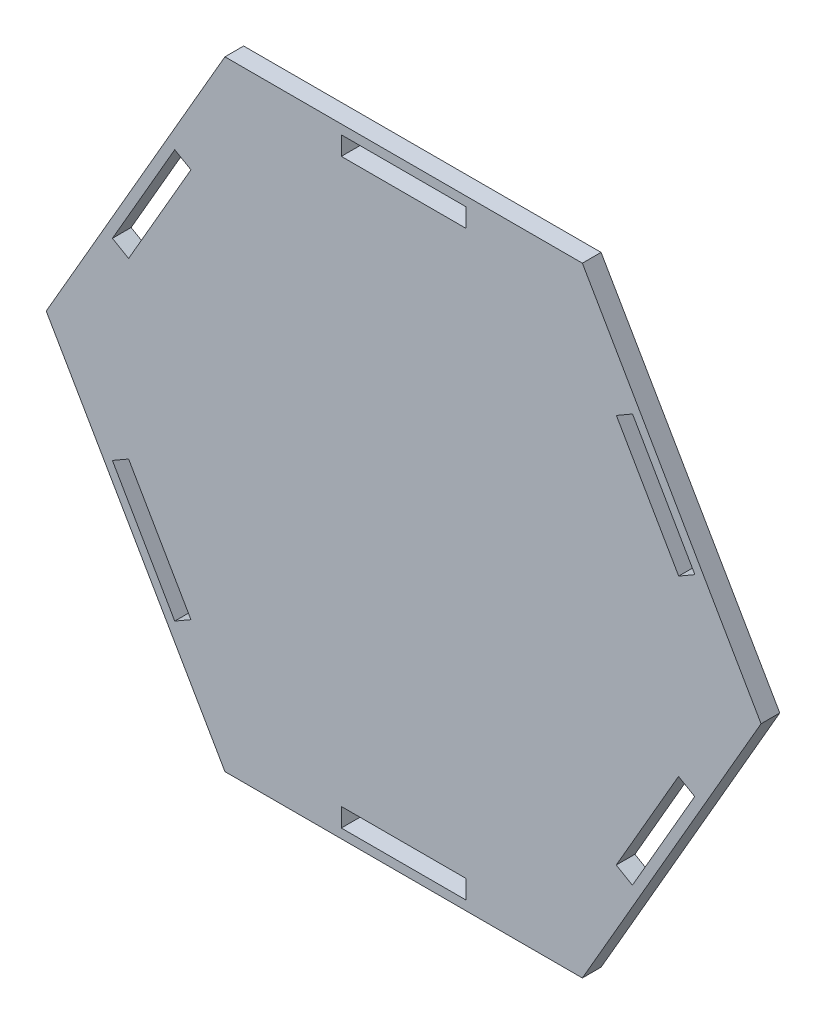
ISO-10303-21;
HEADER;
FILE_DESCRIPTION(('STEP AP214'),'2;1');
FILE_NAME('part.step','',(''),(''),'','','');
FILE_SCHEMA(('AUTOMOTIVE_DESIGN { 1 0 10303 214 1 1 1 1 }'));
ENDSEC;
DATA;
#1=APPLICATION_CONTEXT('core data for automotive mechanical design processes');
#2=APPLICATION_PROTOCOL_DEFINITION('international standard','automotive_design',2000,#1);
#3=PRODUCT_CONTEXT('',#1,'mechanical');
#4=PRODUCT('Part','Part','',(#3));
#5=PRODUCT_RELATED_PRODUCT_CATEGORY('part','',(#4));
#6=PRODUCT_DEFINITION_FORMATION('','',#4);
#7=PRODUCT_DEFINITION_CONTEXT('part definition',#1,'design');
#8=PRODUCT_DEFINITION('design','',#6,#7);
#9=PRODUCT_DEFINITION_SHAPE('','',#8);
#10=(LENGTH_UNIT() NAMED_UNIT(*) SI_UNIT(.MILLI.,.METRE.));
#11=(NAMED_UNIT(*) PLANE_ANGLE_UNIT() SI_UNIT($,.RADIAN.));
#12=(NAMED_UNIT(*) SI_UNIT($,.STERADIAN.) SOLID_ANGLE_UNIT());
#13=UNCERTAINTY_MEASURE_WITH_UNIT(LENGTH_MEASURE(1.E-05),#10,'distance_accuracy_value','');
#14=(GEOMETRIC_REPRESENTATION_CONTEXT(3) GLOBAL_UNCERTAINTY_ASSIGNED_CONTEXT((#13)) GLOBAL_UNIT_ASSIGNED_CONTEXT((#10,
#11,#12)) REPRESENTATION_CONTEXT('',''));
#15=CARTESIAN_POINT('',(0.,0.,0.));
#16=DIRECTION('',(0.,0.,1.));
#17=DIRECTION('',(1.,0.,0.));
#18=AXIS2_PLACEMENT_3D('',#15,#16,#17);
#19=CARTESIAN_POINT('',(0.,0.,3.));
#20=DIRECTION('',(0.,0.,1.));
#21=DIRECTION('',(1.,0.,0.));
#22=AXIS2_PLACEMENT_3D('',#19,#20,#21);
#23=PLANE('',#22);
#24=DIRECTION('',(0.5,0.866025403784439,0.));
#25=VECTOR('',#24,1.);
#26=CARTESIAN_POINT('',(120.785258915504,6.03675021265521,3.));
#27=LINE('',#26,#25);
#28=CARTESIAN_POINT('',(120.785258915504,6.03675021265521,3.));
#29=VERTEX_POINT('',#28);
#30=CARTESIAN_POINT('',(149.457182745941,55.6979790377182,3.));
#31=VERTEX_POINT('',#30);
#32=EDGE_CURVE('E500',#29,#31,#27,.T.);
#33=ORIENTED_EDGE('',*,*,#32,.T.);
#34=DIRECTION('',(-0.499999999999999,0.866025403784439,0.));
#35=VECTOR('',#34,1.);
#36=CARTESIAN_POINT('',(149.457182745941,55.6979790377182,3.));
#37=LINE('',#36,#35);
#38=CARTESIAN_POINT('',(120.785258915504,105.359207862781,3.));
#39=VERTEX_POINT('',#38);
#40=EDGE_CURVE('E504',#31,#39,#37,.T.);
#41=ORIENTED_EDGE('',*,*,#40,.T.);
#42=DIRECTION('',(-1.,0.,0.));
#43=VECTOR('',#42,1.);
#44=CARTESIAN_POINT('',(120.785258915504,105.359207862781,3.));
#45=LINE('',#44,#43);
#46=CARTESIAN_POINT('',(63.4414112546282,105.359207862781,3.));
#47=VERTEX_POINT('',#46);
#48=EDGE_CURVE('E508',#39,#47,#45,.T.);
#49=ORIENTED_EDGE('',*,*,#48,.T.);
#50=DIRECTION('',(-0.5,-0.866025403784438,0.));
#51=VECTOR('',#50,1.);
#52=CARTESIAN_POINT('',(63.4414112546282,105.359207862781,3.));
#53=LINE('',#52,#51);
#54=CARTESIAN_POINT('',(34.7694874241905,55.6979790377182,3.));
#55=VERTEX_POINT('',#54);
#56=EDGE_CURVE('E511',#47,#55,#53,.T.);
#57=ORIENTED_EDGE('',*,*,#56,.T.);
#58=DIRECTION('',(0.5,-0.866025403784439,0.));
#59=VECTOR('',#58,1.);
#60=CARTESIAN_POINT('',(34.7694874241905,55.6979790377182,3.));
#61=LINE('',#60,#59);
#62=CARTESIAN_POINT('',(63.4414112546282,6.03675021265524,3.));
#63=VERTEX_POINT('',#62);
#64=EDGE_CURVE('E514',#55,#63,#61,.T.);
#65=ORIENTED_EDGE('',*,*,#64,.T.);
#66=DIRECTION('',(1.,0.,0.));
#67=VECTOR('',#66,1.);
#68=CARTESIAN_POINT('',(63.4414112546282,6.03675021265524,3.));
#69=LINE('',#68,#67);
#70=EDGE_CURVE('E517',#63,#29,#69,.T.);
#71=ORIENTED_EDGE('',*,*,#70,.T.);
#72=EDGE_LOOP('',(#33,#41,#49,#57,#65,#71));
#73=FACE_BOUND('',#72,.T.);
#74=DIRECTION('',(0.,-1.,0.));
#75=VECTOR('',#74,1.);
#76=CARTESIAN_POINT('',(82.113335085066,103.859207862781,3.));
#77=LINE('',#76,#75);
#78=CARTESIAN_POINT('',(82.113335085066,103.859207862781,3.));
#79=VERTEX_POINT('',#78);
#80=CARTESIAN_POINT('',(82.113335085066,100.859207862781,3.));
#81=VERTEX_POINT('',#80);
#82=EDGE_CURVE('E460',#79,#81,#77,.T.);
#83=ORIENTED_EDGE('',*,*,#82,.F.);
#84=DIRECTION('',(-1.,0.,0.));
#85=VECTOR('',#84,1.);
#86=CARTESIAN_POINT('',(102.113335085066,103.859207862781,3.));
#87=LINE('',#86,#85);
#88=CARTESIAN_POINT('',(102.113335085066,103.859207862781,3.));
#89=VERTEX_POINT('',#88);
#90=EDGE_CURVE('E457',#89,#79,#87,.T.);
#91=ORIENTED_EDGE('',*,*,#90,.F.);
#92=DIRECTION('',(0.,1.,0.));
#93=VECTOR('',#92,1.);
#94=CARTESIAN_POINT('',(102.113335085066,100.859207862781,3.));
#95=LINE('',#94,#93);
#96=CARTESIAN_POINT('',(102.113335085066,100.859207862781,3.));
#97=VERTEX_POINT('',#96);
#98=EDGE_CURVE('E468',#97,#89,#95,.T.);
#99=ORIENTED_EDGE('',*,*,#98,.F.);
#100=DIRECTION('',(1.,0.,0.));
#101=VECTOR('',#100,1.);
#102=CARTESIAN_POINT('',(82.113335085066,100.859207862781,3.));
#103=LINE('',#102,#101);
#104=EDGE_CURVE('E464',#81,#97,#103,.T.);
#105=ORIENTED_EDGE('',*,*,#104,.F.);
#106=EDGE_LOOP('',(#83,#91,#99,#105));
#107=FACE_BOUND('',#106,.T.);
#108=DIRECTION('',(0.,-1.,0.));
#109=VECTOR('',#108,1.);
#110=CARTESIAN_POINT('',(82.113335085066,10.5367502126552,3.));
#111=LINE('',#110,#109);
#112=CARTESIAN_POINT('',(82.113335085066,10.5367502126552,3.));
#113=VERTEX_POINT('',#112);
#114=CARTESIAN_POINT('',(82.113335085066,7.53675021265524,3.));
#115=VERTEX_POINT('',#114);
#116=EDGE_CURVE('E417',#113,#115,#111,.T.);
#117=ORIENTED_EDGE('',*,*,#116,.F.);
#118=DIRECTION('',(-1.,0.,0.));
#119=VECTOR('',#118,1.);
#120=CARTESIAN_POINT('',(102.113335085066,10.5367502126552,3.));
#121=LINE('',#120,#119);
#122=CARTESIAN_POINT('',(102.113335085066,10.5367502126552,3.));
#123=VERTEX_POINT('',#122);
#124=EDGE_CURVE('E414',#123,#113,#121,.T.);
#125=ORIENTED_EDGE('',*,*,#124,.F.);
#126=DIRECTION('',(0.,1.,0.));
#127=VECTOR('',#126,1.);
#128=CARTESIAN_POINT('',(102.113335085066,7.53675021265524,3.));
#129=LINE('',#128,#127);
#130=CARTESIAN_POINT('',(102.113335085066,7.53675021265524,3.));
#131=VERTEX_POINT('',#130);
#132=EDGE_CURVE('E425',#131,#123,#129,.T.);
#133=ORIENTED_EDGE('',*,*,#132,.F.);
#134=DIRECTION('',(1.,0.,0.));
#135=VECTOR('',#134,1.);
#136=CARTESIAN_POINT('',(82.113335085066,7.53675021265524,3.));
#137=LINE('',#136,#135);
#138=EDGE_CURVE('E421',#115,#131,#137,.T.);
#139=ORIENTED_EDGE('',*,*,#138,.F.);
#140=EDGE_LOOP('',(#117,#125,#133,#139));
#141=FACE_BOUND('',#140,.T.);
#142=DIRECTION('',(0.866025403784437,-0.500000000000003,0.));
#143=VECTOR('',#142,1.);
#144=CARTESIAN_POINT('',(126.215627262416,24.442424093322,3.));
#145=LINE('',#144,#143);
#146=CARTESIAN_POINT('',(126.215627262416,24.442424093322,3.));
#147=VERTEX_POINT('',#146);
#148=CARTESIAN_POINT('',(128.81370347377,22.942424093322,3.));
#149=VERTEX_POINT('',#148);
#150=EDGE_CURVE('E374',#147,#149,#145,.T.);
#151=ORIENTED_EDGE('',*,*,#150,.F.);
#152=DIRECTION('',(-0.499999999999998,-0.86602540378444,0.));
#153=VECTOR('',#152,1.);
#154=CARTESIAN_POINT('',(136.215627262416,41.7629321690107,3.));
#155=LINE('',#154,#153);
#156=CARTESIAN_POINT('',(136.215627262416,41.7629321690107,3.));
#157=VERTEX_POINT('',#156);
#158=EDGE_CURVE('E371',#157,#147,#155,.T.);
#159=ORIENTED_EDGE('',*,*,#158,.F.);
#160=DIRECTION('',(-0.866025403784439,0.499999999999998,0.));
#161=VECTOR('',#160,1.);
#162=CARTESIAN_POINT('',(138.81370347377,40.2629321690107,3.));
#163=LINE('',#162,#161);
#164=CARTESIAN_POINT('',(138.81370347377,40.2629321690107,3.));
#165=VERTEX_POINT('',#164);
#166=EDGE_CURVE('E382',#165,#157,#163,.T.);
#167=ORIENTED_EDGE('',*,*,#166,.F.);
#168=DIRECTION('',(0.499999999999999,0.866025403784439,0.));
#169=VECTOR('',#168,1.);
#170=CARTESIAN_POINT('',(128.81370347377,22.942424093322,3.));
#171=LINE('',#170,#169);
#172=EDGE_CURVE('E378',#149,#165,#171,.T.);
#173=ORIENTED_EDGE('',*,*,#172,.F.);
#174=EDGE_LOOP('',(#151,#159,#167,#173));
#175=FACE_BOUND('',#174,.T.);
#176=DIRECTION('',(-0.866025403784437,-0.500000000000003,0.));
#177=VECTOR('',#176,1.);
#178=CARTESIAN_POINT('',(128.839141227598,88.4290564920805,3.));
#179=LINE('',#178,#177);
#180=CARTESIAN_POINT('',(128.839141227598,88.4290564920805,3.));
#181=VERTEX_POINT('',#180);
#182=CARTESIAN_POINT('',(126.241065016245,86.9290564920805,3.));
#183=VERTEX_POINT('',#182);
#184=EDGE_CURVE('E331',#181,#183,#179,.T.);
#185=ORIENTED_EDGE('',*,*,#184,.F.);
#186=DIRECTION('',(-0.499999999999998,0.86602540378444,0.));
#187=VECTOR('',#186,1.);
#188=CARTESIAN_POINT('',(138.839141227598,71.1085484163918,3.));
#189=LINE('',#188,#187);
#190=CARTESIAN_POINT('',(138.839141227598,71.1085484163918,3.));
#191=VERTEX_POINT('',#190);
#192=EDGE_CURVE('E328',#191,#181,#189,.T.);
#193=ORIENTED_EDGE('',*,*,#192,.F.);
#194=DIRECTION('',(0.866025403784439,0.499999999999998,0.));
#195=VECTOR('',#194,1.);
#196=CARTESIAN_POINT('',(136.241065016245,69.6085484163918,3.));
#197=LINE('',#196,#195);
#198=CARTESIAN_POINT('',(136.241065016245,69.6085484163918,3.));
#199=VERTEX_POINT('',#198);
#200=EDGE_CURVE('E339',#199,#191,#197,.T.);
#201=ORIENTED_EDGE('',*,*,#200,.F.);
#202=DIRECTION('',(0.499999999999997,-0.86602540378444,0.));
#203=VECTOR('',#202,1.);
#204=CARTESIAN_POINT('',(126.241065016245,86.9290564920805,3.));
#205=LINE('',#204,#203);
#206=EDGE_CURVE('E335',#183,#199,#205,.T.);
#207=ORIENTED_EDGE('',*,*,#206,.F.);
#208=EDGE_LOOP('',(#185,#193,#201,#207));
#209=FACE_BOUND('',#208,.T.);
#210=DIRECTION('',(0.866025403784439,0.499999999999999,0.));
#211=VECTOR('',#210,1.);
#212=CARTESIAN_POINT('',(55.3875289425339,22.9277375993015,3.));
#213=LINE('',#212,#211);
#214=CARTESIAN_POINT('',(55.3875289425339,22.9277375993015,3.));
#215=VERTEX_POINT('',#214);
#216=CARTESIAN_POINT('',(57.9856051538872,24.4277375993015,3.));
#217=VERTEX_POINT('',#216);
#218=EDGE_CURVE('E288',#215,#217,#213,.T.);
#219=ORIENTED_EDGE('',*,*,#218,.F.);
#220=DIRECTION('',(0.5,-0.866025403784439,0.));
#221=VECTOR('',#220,1.);
#222=CARTESIAN_POINT('',(45.3875289425339,40.2482456749903,3.));
#223=LINE('',#222,#221);
#224=CARTESIAN_POINT('',(45.3875289425339,40.2482456749903,3.));
#225=VERTEX_POINT('',#224);
#226=EDGE_CURVE('E285',#225,#215,#223,.T.);
#227=ORIENTED_EDGE('',*,*,#226,.F.);
#228=DIRECTION('',(-0.866025403784438,-0.500000000000001,0.));
#229=VECTOR('',#228,1.);
#230=CARTESIAN_POINT('',(47.9856051538872,41.7482456749903,3.));
#231=LINE('',#230,#229);
#232=CARTESIAN_POINT('',(47.9856051538872,41.7482456749903,3.));
#233=VERTEX_POINT('',#232);
#234=EDGE_CURVE('E296',#233,#225,#231,.T.);
#235=ORIENTED_EDGE('',*,*,#234,.F.);
#236=DIRECTION('',(-0.5,0.866025403784439,0.));
#237=VECTOR('',#236,1.);
#238=CARTESIAN_POINT('',(57.9856051538872,24.4277375993015,3.));
#239=LINE('',#238,#237);
#240=EDGE_CURVE('E292',#217,#233,#239,.T.);
#241=ORIENTED_EDGE('',*,*,#240,.F.);
#242=EDGE_LOOP('',(#219,#227,#235,#241));
#243=FACE_BOUND('',#242,.T.);
#244=DIRECTION('',(0.86602540378444,-0.499999999999997,0.));
#245=VECTOR('',#244,1.);
#246=CARTESIAN_POINT('',(45.3875289425339,71.1085484163916,3.));
#247=LINE('',#246,#245);
#248=CARTESIAN_POINT('',(45.3875289425339,71.1085484163916,3.));
#249=VERTEX_POINT('',#248);
#250=CARTESIAN_POINT('',(47.9856051538872,69.6085484163917,3.));
#251=VERTEX_POINT('',#250);
#252=EDGE_CURVE('E246',#249,#251,#247,.T.);
#253=ORIENTED_EDGE('',*,*,#252,.F.);
#254=DIRECTION('',(-0.499999999999997,-0.86602540378444,0.));
#255=VECTOR('',#254,1.);
#256=CARTESIAN_POINT('',(55.3875289425338,88.4290564920804,3.));
#257=LINE('',#256,#255);
#258=CARTESIAN_POINT('',(55.3875289425338,88.4290564920804,3.));
#259=VERTEX_POINT('',#258);
#260=EDGE_CURVE('E237',#259,#249,#257,.T.);
#261=ORIENTED_EDGE('',*,*,#260,.F.);
#262=DIRECTION('',(-0.866025403784438,0.500000000000001,0.));
#263=VECTOR('',#262,1.);
#264=CARTESIAN_POINT('',(57.9856051538871,86.9290564920804,3.));
#265=LINE('',#264,#263);
#266=CARTESIAN_POINT('',(57.9856051538871,86.9290564920804,3.));
#267=VERTEX_POINT('',#266);
#268=EDGE_CURVE('E263',#267,#259,#265,.T.);
#269=ORIENTED_EDGE('',*,*,#268,.F.);
#270=DIRECTION('',(0.499999999999997,0.86602540378444,0.));
#271=VECTOR('',#270,1.);
#272=CARTESIAN_POINT('',(47.9856051538872,69.6085484163917,3.));
#273=LINE('',#272,#271);
#274=EDGE_CURVE('E259',#251,#267,#273,.T.);
#275=ORIENTED_EDGE('',*,*,#274,.F.);
#276=EDGE_LOOP('',(#253,#261,#269,#275));
#277=FACE_BOUND('',#276,.T.);
#278=ADVANCED_FACE('F39',(#73,#107,#141,#175,#209,#243,#277),#23,.T.);
#279=CARTESIAN_POINT('',(0.,0.,0.));
#280=DIRECTION('',(0.,0.,1.));
#281=DIRECTION('',(1.,0.,0.));
#282=AXIS2_PLACEMENT_3D('',#279,#280,#281);
#283=PLANE('',#282);
#284=DIRECTION('',(0.5,-0.866025403784439,0.));
#285=VECTOR('',#284,1.);
#286=CARTESIAN_POINT('',(45.3875289425339,40.2482456749903,0.));
#287=LINE('',#286,#285);
#288=CARTESIAN_POINT('',(45.3875289425339,40.2482456749903,0.));
#289=VERTEX_POINT('',#288);
#290=CARTESIAN_POINT('',(55.3875289425339,22.9277375993015,0.));
#291=VERTEX_POINT('',#290);
#292=EDGE_CURVE('E255',#289,#291,#287,.T.);
#293=ORIENTED_EDGE('',*,*,#292,.T.);
#294=DIRECTION('',(0.866025403784439,0.499999999999999,0.));
#295=VECTOR('',#294,1.);
#296=CARTESIAN_POINT('',(55.3875289425339,22.9277375993015,0.));
#297=LINE('',#296,#295);
#298=CARTESIAN_POINT('',(57.9856051538872,24.4277375993015,0.));
#299=VERTEX_POINT('',#298);
#300=EDGE_CURVE('E303',#291,#299,#297,.T.);
#301=ORIENTED_EDGE('',*,*,#300,.T.);
#302=DIRECTION('',(-0.5,0.866025403784439,0.));
#303=VECTOR('',#302,1.);
#304=CARTESIAN_POINT('',(57.9856051538872,24.4277375993015,0.));
#305=LINE('',#304,#303);
#306=CARTESIAN_POINT('',(47.9856051538872,41.7482456749903,0.));
#307=VERTEX_POINT('',#306);
#308=EDGE_CURVE('E307',#299,#307,#305,.T.);
#309=ORIENTED_EDGE('',*,*,#308,.T.);
#310=DIRECTION('',(-0.866025403784438,-0.500000000000001,0.));
#311=VECTOR('',#310,1.);
#312=CARTESIAN_POINT('',(47.9856051538872,41.7482456749903,0.));
#313=LINE('',#312,#311);
#314=EDGE_CURVE('E289',#307,#289,#313,.T.);
#315=ORIENTED_EDGE('',*,*,#314,.T.);
#316=EDGE_LOOP('',(#293,#301,#309,#315));
#317=FACE_BOUND('',#316,.T.);
#318=DIRECTION('',(-0.499999999999998,-0.86602540378444,0.));
#319=VECTOR('',#318,1.);
#320=CARTESIAN_POINT('',(136.215627262416,41.7629321690107,0.));
#321=LINE('',#320,#319);
#322=CARTESIAN_POINT('',(136.215627262416,41.7629321690107,0.));
#323=VERTEX_POINT('',#322);
#324=CARTESIAN_POINT('',(126.215627262416,24.442424093322,0.));
#325=VERTEX_POINT('',#324);
#326=EDGE_CURVE('E370',#323,#325,#321,.T.);
#327=ORIENTED_EDGE('',*,*,#326,.T.);
#328=DIRECTION('',(0.866025403784437,-0.500000000000003,0.));
#329=VECTOR('',#328,1.);
#330=CARTESIAN_POINT('',(126.215627262416,24.442424093322,0.));
#331=LINE('',#330,#329);
#332=CARTESIAN_POINT('',(128.81370347377,22.942424093322,0.));
#333=VERTEX_POINT('',#332);
#334=EDGE_CURVE('E389',#325,#333,#331,.T.);
#335=ORIENTED_EDGE('',*,*,#334,.T.);
#336=DIRECTION('',(0.499999999999999,0.866025403784439,0.));
#337=VECTOR('',#336,1.);
#338=CARTESIAN_POINT('',(128.81370347377,22.942424093322,0.));
#339=LINE('',#338,#337);
#340=CARTESIAN_POINT('',(138.81370347377,40.2629321690107,0.));
#341=VERTEX_POINT('',#340);
#342=EDGE_CURVE('E393',#333,#341,#339,.T.);
#343=ORIENTED_EDGE('',*,*,#342,.T.);
#344=DIRECTION('',(-0.866025403784439,0.499999999999998,0.));
#345=VECTOR('',#344,1.);
#346=CARTESIAN_POINT('',(138.81370347377,40.2629321690107,0.));
#347=LINE('',#346,#345);
#348=EDGE_CURVE('E375',#341,#323,#347,.T.);
#349=ORIENTED_EDGE('',*,*,#348,.T.);
#350=EDGE_LOOP('',(#327,#335,#343,#349));
#351=FACE_BOUND('',#350,.T.);
#352=DIRECTION('',(-1.,0.,0.));
#353=VECTOR('',#352,1.);
#354=CARTESIAN_POINT('',(102.113335085066,103.859207862781,0.));
#355=LINE('',#354,#353);
#356=CARTESIAN_POINT('',(102.113335085066,103.859207862781,0.));
#357=VERTEX_POINT('',#356);
#358=CARTESIAN_POINT('',(82.113335085066,103.859207862781,0.));
#359=VERTEX_POINT('',#358);
#360=EDGE_CURVE('E456',#357,#359,#355,.T.);
#361=ORIENTED_EDGE('',*,*,#360,.T.);
#362=DIRECTION('',(0.,-1.,0.));
#363=VECTOR('',#362,1.);
#364=CARTESIAN_POINT('',(82.113335085066,103.859207862781,0.));
#365=LINE('',#364,#363);
#366=CARTESIAN_POINT('',(82.113335085066,100.859207862781,0.));
#367=VERTEX_POINT('',#366);
#368=EDGE_CURVE('E475',#359,#367,#365,.T.);
#369=ORIENTED_EDGE('',*,*,#368,.T.);
#370=DIRECTION('',(1.,0.,0.));
#371=VECTOR('',#370,1.);
#372=CARTESIAN_POINT('',(82.113335085066,100.859207862781,0.));
#373=LINE('',#372,#371);
#374=CARTESIAN_POINT('',(102.113335085066,100.859207862781,0.));
#375=VERTEX_POINT('',#374);
#376=EDGE_CURVE('E479',#367,#375,#373,.T.);
#377=ORIENTED_EDGE('',*,*,#376,.T.);
#378=DIRECTION('',(0.,1.,0.));
#379=VECTOR('',#378,1.);
#380=CARTESIAN_POINT('',(102.113335085066,100.859207862781,0.));
#381=LINE('',#380,#379);
#382=EDGE_CURVE('E461',#375,#357,#381,.T.);
#383=ORIENTED_EDGE('',*,*,#382,.T.);
#384=EDGE_LOOP('',(#361,#369,#377,#383));
#385=FACE_BOUND('',#384,.T.);
#386=DIRECTION('',(0.5,0.866025403784439,0.));
#387=VECTOR('',#386,1.);
#388=CARTESIAN_POINT('',(120.785258915504,6.03675021265521,0.));
#389=LINE('',#388,#387);
#390=CARTESIAN_POINT('',(120.785258915504,6.03675021265521,0.));
#391=VERTEX_POINT('',#390);
#392=CARTESIAN_POINT('',(149.457182745941,55.6979790377182,0.));
#393=VERTEX_POINT('',#392);
#394=EDGE_CURVE('E499',#391,#393,#389,.T.);
#395=ORIENTED_EDGE('',*,*,#394,.F.);
#396=DIRECTION('',(1.,0.,0.));
#397=VECTOR('',#396,1.);
#398=CARTESIAN_POINT('',(63.4414112546282,6.03675021265524,0.));
#399=LINE('',#398,#397);
#400=CARTESIAN_POINT('',(63.4414112546282,6.03675021265524,0.));
#401=VERTEX_POINT('',#400);
#402=EDGE_CURVE('E505',#401,#391,#399,.T.);
#403=ORIENTED_EDGE('',*,*,#402,.F.);
#404=DIRECTION('',(0.5,-0.866025403784439,0.));
#405=VECTOR('',#404,1.);
#406=CARTESIAN_POINT('',(34.7694874241905,55.6979790377182,0.));
#407=LINE('',#406,#405);
#408=CARTESIAN_POINT('',(34.7694874241905,55.6979790377182,0.));
#409=VERTEX_POINT('',#408);
#410=EDGE_CURVE('E533',#409,#401,#407,.T.);
#411=ORIENTED_EDGE('',*,*,#410,.F.);
#412=DIRECTION('',(-0.5,-0.866025403784438,0.));
#413=VECTOR('',#412,1.);
#414=CARTESIAN_POINT('',(63.4414112546282,105.359207862781,0.));
#415=LINE('',#414,#413);
#416=CARTESIAN_POINT('',(63.4414112546282,105.359207862781,0.));
#417=VERTEX_POINT('',#416);
#418=EDGE_CURVE('E530',#417,#409,#415,.T.);
#419=ORIENTED_EDGE('',*,*,#418,.F.);
#420=DIRECTION('',(-1.,0.,0.));
#421=VECTOR('',#420,1.);
#422=CARTESIAN_POINT('',(120.785258915504,105.359207862781,0.));
#423=LINE('',#422,#421);
#424=CARTESIAN_POINT('',(120.785258915504,105.359207862781,0.));
#425=VERTEX_POINT('',#424);
#426=EDGE_CURVE('E527',#425,#417,#423,.T.);
#427=ORIENTED_EDGE('',*,*,#426,.F.);
#428=DIRECTION('',(-0.499999999999999,0.866025403784439,0.));
#429=VECTOR('',#428,1.);
#430=CARTESIAN_POINT('',(149.457182745941,55.6979790377182,0.));
#431=LINE('',#430,#429);
#432=EDGE_CURVE('E524',#393,#425,#431,.T.);
#433=ORIENTED_EDGE('',*,*,#432,.F.);
#434=EDGE_LOOP('',(#395,#403,#411,#419,#427,#433));
#435=FACE_BOUND('',#434,.T.);
#436=DIRECTION('',(-1.,0.,0.));
#437=VECTOR('',#436,1.);
#438=CARTESIAN_POINT('',(102.113335085066,10.5367502126552,0.));
#439=LINE('',#438,#437);
#440=CARTESIAN_POINT('',(102.113335085066,10.5367502126552,0.));
#441=VERTEX_POINT('',#440);
#442=CARTESIAN_POINT('',(82.113335085066,10.5367502126552,0.));
#443=VERTEX_POINT('',#442);
#444=EDGE_CURVE('E413',#441,#443,#439,.T.);
#445=ORIENTED_EDGE('',*,*,#444,.T.);
#446=DIRECTION('',(0.,-1.,0.));
#447=VECTOR('',#446,1.);
#448=CARTESIAN_POINT('',(82.113335085066,10.5367502126552,0.));
#449=LINE('',#448,#447);
#450=CARTESIAN_POINT('',(82.113335085066,7.53675021265524,0.));
#451=VERTEX_POINT('',#450);
#452=EDGE_CURVE('E432',#443,#451,#449,.T.);
#453=ORIENTED_EDGE('',*,*,#452,.T.);
#454=DIRECTION('',(1.,0.,0.));
#455=VECTOR('',#454,1.);
#456=CARTESIAN_POINT('',(82.113335085066,7.53675021265524,0.));
#457=LINE('',#456,#455);
#458=CARTESIAN_POINT('',(102.113335085066,7.53675021265524,0.));
#459=VERTEX_POINT('',#458);
#460=EDGE_CURVE('E436',#451,#459,#457,.T.);
#461=ORIENTED_EDGE('',*,*,#460,.T.);
#462=DIRECTION('',(0.,1.,0.));
#463=VECTOR('',#462,1.);
#464=CARTESIAN_POINT('',(102.113335085066,7.53675021265524,0.));
#465=LINE('',#464,#463);
#466=EDGE_CURVE('E418',#459,#441,#465,.T.);
#467=ORIENTED_EDGE('',*,*,#466,.T.);
#468=EDGE_LOOP('',(#445,#453,#461,#467));
#469=FACE_BOUND('',#468,.T.);
#470=DIRECTION('',(-0.499999999999998,0.86602540378444,0.));
#471=VECTOR('',#470,1.);
#472=CARTESIAN_POINT('',(138.839141227598,71.1085484163918,0.));
#473=LINE('',#472,#471);
#474=CARTESIAN_POINT('',(138.839141227598,71.1085484163918,0.));
#475=VERTEX_POINT('',#474);
#476=CARTESIAN_POINT('',(128.839141227598,88.4290564920805,0.));
#477=VERTEX_POINT('',#476);
#478=EDGE_CURVE('E327',#475,#477,#473,.T.);
#479=ORIENTED_EDGE('',*,*,#478,.T.);
#480=DIRECTION('',(-0.866025403784437,-0.500000000000003,0.));
#481=VECTOR('',#480,1.);
#482=CARTESIAN_POINT('',(128.839141227598,88.4290564920805,0.));
#483=LINE('',#482,#481);
#484=CARTESIAN_POINT('',(126.241065016245,86.9290564920805,0.));
#485=VERTEX_POINT('',#484);
#486=EDGE_CURVE('E346',#477,#485,#483,.T.);
#487=ORIENTED_EDGE('',*,*,#486,.T.);
#488=DIRECTION('',(0.499999999999997,-0.86602540378444,0.));
#489=VECTOR('',#488,1.);
#490=CARTESIAN_POINT('',(126.241065016245,86.9290564920805,0.));
#491=LINE('',#490,#489);
#492=CARTESIAN_POINT('',(136.241065016245,69.6085484163918,0.));
#493=VERTEX_POINT('',#492);
#494=EDGE_CURVE('E350',#485,#493,#491,.T.);
#495=ORIENTED_EDGE('',*,*,#494,.T.);
#496=DIRECTION('',(0.866025403784439,0.499999999999998,0.));
#497=VECTOR('',#496,1.);
#498=CARTESIAN_POINT('',(136.241065016245,69.6085484163918,0.));
#499=LINE('',#498,#497);
#500=EDGE_CURVE('E332',#493,#475,#499,.T.);
#501=ORIENTED_EDGE('',*,*,#500,.T.);
#502=EDGE_LOOP('',(#479,#487,#495,#501));
#503=FACE_BOUND('',#502,.T.);
#504=DIRECTION('',(-0.499999999999997,-0.86602540378444,0.));
#505=VECTOR('',#504,1.);
#506=CARTESIAN_POINT('',(55.3875289425338,88.4290564920804,0.));
#507=LINE('',#506,#505);
#508=CARTESIAN_POINT('',(55.3875289425338,88.4290564920804,0.));
#509=VERTEX_POINT('',#508);
#510=CARTESIAN_POINT('',(45.3875289425339,71.1085484163916,0.));
#511=VERTEX_POINT('',#510);
#512=EDGE_CURVE('E63',#509,#511,#507,.T.);
#513=ORIENTED_EDGE('',*,*,#512,.T.);
#514=DIRECTION('',(0.86602540378444,-0.499999999999997,0.));
#515=VECTOR('',#514,1.);
#516=CARTESIAN_POINT('',(45.3875289425339,71.1085484163916,0.));
#517=LINE('',#516,#515);
#518=CARTESIAN_POINT('',(47.9856051538872,69.6085484163917,0.));
#519=VERTEX_POINT('',#518);
#520=EDGE_CURVE('E253',#511,#519,#517,.T.);
#521=ORIENTED_EDGE('',*,*,#520,.T.);
#522=DIRECTION('',(0.499999999999997,0.86602540378444,0.));
#523=VECTOR('',#522,1.);
#524=CARTESIAN_POINT('',(47.9856051538872,69.6085484163917,0.));
#525=LINE('',#524,#523);
#526=CARTESIAN_POINT('',(57.9856051538871,86.9290564920804,0.));
#527=VERTEX_POINT('',#526);
#528=EDGE_CURVE('E272',#519,#527,#525,.T.);
#529=ORIENTED_EDGE('',*,*,#528,.T.);
#530=DIRECTION('',(-0.866025403784438,0.500000000000001,0.));
#531=VECTOR('',#530,1.);
#532=CARTESIAN_POINT('',(57.9856051538871,86.9290564920804,0.));
#533=LINE('',#532,#531);
#534=EDGE_CURVE('E247',#527,#509,#533,.T.);
#535=ORIENTED_EDGE('',*,*,#534,.T.);
#536=EDGE_LOOP('',(#513,#521,#529,#535));
#537=FACE_BOUND('',#536,.T.);
#538=ADVANCED_FACE('F564',(#317,#351,#385,#435,#469,#503,#537),#283,.F.);
#539=CARTESIAN_POINT('',(120.785258915504,6.03675021265521,3.));
#540=DIRECTION('',(-0.866025403784439,0.5,0.));
#541=DIRECTION('',(-0.5,-0.866025403784439,0.));
#542=AXIS2_PLACEMENT_3D('',#539,#540,#541);
#543=PLANE('',#542);
#544=ORIENTED_EDGE('',*,*,#394,.T.);
#545=DIRECTION('',(0.,0.,-1.));
#546=VECTOR('',#545,1.);
#547=CARTESIAN_POINT('',(149.457182745941,55.6979790377182,3.));
#548=LINE('',#547,#546);
#549=EDGE_CURVE('E11',#31,#393,#548,.T.);
#550=ORIENTED_EDGE('',*,*,#549,.F.);
#551=ORIENTED_EDGE('',*,*,#32,.F.);
#552=DIRECTION('',(0.,0.,-1.));
#553=VECTOR('',#552,1.);
#554=CARTESIAN_POINT('',(120.785258915504,6.03675021265521,3.));
#555=LINE('',#554,#553);
#556=EDGE_CURVE('E520',#29,#391,#555,.T.);
#557=ORIENTED_EDGE('',*,*,#556,.T.);
#558=EDGE_LOOP('',(#544,#550,#551,#557));
#559=FACE_BOUND('',#558,.T.);
#560=ADVANCED_FACE('F41',(#559),#543,.F.);
#561=CARTESIAN_POINT('',(149.457182745941,55.6979790377182,3.));
#562=DIRECTION('',(-0.866025403784439,-0.499999999999999,0.));
#563=DIRECTION('',(0.499999999999999,-0.866025403784439,0.));
#564=AXIS2_PLACEMENT_3D('',#561,#562,#563);
#565=PLANE('',#564);
#566=ORIENTED_EDGE('',*,*,#432,.T.);
#567=DIRECTION('',(0.,0.,-1.));
#568=VECTOR('',#567,1.);
#569=CARTESIAN_POINT('',(120.785258915504,105.359207862781,3.));
#570=LINE('',#569,#568);
#571=EDGE_CURVE('E48',#39,#425,#570,.T.);
#572=ORIENTED_EDGE('',*,*,#571,.F.);
#573=ORIENTED_EDGE('',*,*,#40,.F.);
#574=ORIENTED_EDGE('',*,*,#549,.T.);
#575=EDGE_LOOP('',(#566,#572,#573,#574));
#576=FACE_BOUND('',#575,.T.);
#577=ADVANCED_FACE('F582',(#576),#565,.F.);
#578=CARTESIAN_POINT('',(120.785258915504,105.359207862781,3.));
#579=DIRECTION('',(0.,-1.,0.));
#580=DIRECTION('',(0.,0.,-1.));
#581=AXIS2_PLACEMENT_3D('',#578,#579,#580);
#582=PLANE('',#581);
#583=ORIENTED_EDGE('',*,*,#426,.T.);
#584=DIRECTION('',(0.,0.,-1.));
#585=VECTOR('',#584,1.);
#586=CARTESIAN_POINT('',(63.4414112546282,105.359207862781,3.));
#587=LINE('',#586,#585);
#588=EDGE_CURVE('E549',#47,#417,#587,.T.);
#589=ORIENTED_EDGE('',*,*,#588,.F.);
#590=ORIENTED_EDGE('',*,*,#48,.F.);
#591=ORIENTED_EDGE('',*,*,#571,.T.);
#592=EDGE_LOOP('',(#583,#589,#590,#591));
#593=FACE_BOUND('',#592,.T.);
#594=ADVANCED_FACE('F558',(#593),#582,.F.);
#595=CARTESIAN_POINT('',(63.4414112546282,105.359207862781,3.));
#596=DIRECTION('',(0.866025403784438,-0.5,0.));
#597=DIRECTION('',(0.5,0.866025403784438,0.));
#598=AXIS2_PLACEMENT_3D('',#595,#596,#597);
#599=PLANE('',#598);
#600=ORIENTED_EDGE('',*,*,#418,.T.);
#601=DIRECTION('',(0.,0.,-1.));
#602=VECTOR('',#601,1.);
#603=CARTESIAN_POINT('',(34.7694874241905,55.6979790377182,3.));
#604=LINE('',#603,#602);
#605=EDGE_CURVE('E545',#55,#409,#604,.T.);
#606=ORIENTED_EDGE('',*,*,#605,.F.);
#607=ORIENTED_EDGE('',*,*,#56,.F.);
#608=ORIENTED_EDGE('',*,*,#588,.T.);
#609=EDGE_LOOP('',(#600,#606,#607,#608));
#610=FACE_BOUND('',#609,.T.);
#611=ADVANCED_FACE('F570',(#610),#599,.F.);
#612=CARTESIAN_POINT('',(34.7694874241905,55.6979790377182,3.));
#613=DIRECTION('',(0.866025403784439,0.5,0.));
#614=DIRECTION('',(-0.5,0.866025403784439,0.));
#615=AXIS2_PLACEMENT_3D('',#612,#613,#614);
#616=PLANE('',#615);
#617=ORIENTED_EDGE('',*,*,#410,.T.);
#618=DIRECTION('',(0.,0.,-1.));
#619=VECTOR('',#618,1.);
#620=CARTESIAN_POINT('',(63.4414112546282,6.03675021265524,3.));
#621=LINE('',#620,#619);
#622=EDGE_CURVE('E541',#63,#401,#621,.T.);
#623=ORIENTED_EDGE('',*,*,#622,.F.);
#624=ORIENTED_EDGE('',*,*,#64,.F.);
#625=ORIENTED_EDGE('',*,*,#605,.T.);
#626=EDGE_LOOP('',(#617,#623,#624,#625));
#627=FACE_BOUND('',#626,.T.);
#628=ADVANCED_FACE('F574',(#627),#616,.F.);
#629=CARTESIAN_POINT('',(63.4414112546282,6.03675021265524,3.));
#630=DIRECTION('',(0.,1.,0.));
#631=DIRECTION('',(-1.,0.,0.));
#632=AXIS2_PLACEMENT_3D('',#629,#630,#631);
#633=PLANE('',#632);
#634=ORIENTED_EDGE('',*,*,#402,.T.);
#635=ORIENTED_EDGE('',*,*,#556,.F.);
#636=ORIENTED_EDGE('',*,*,#70,.F.);
#637=ORIENTED_EDGE('',*,*,#622,.T.);
#638=EDGE_LOOP('',(#634,#635,#636,#637));
#639=FACE_BOUND('',#638,.T.);
#640=ADVANCED_FACE('F585',(#639),#633,.F.);
#641=CARTESIAN_POINT('',(102.113335085066,103.859207862781,3.));
#642=DIRECTION('',(0.,-1.,0.));
#643=DIRECTION('',(0.,0.,-1.));
#644=AXIS2_PLACEMENT_3D('',#641,#642,#643);
#645=PLANE('',#644);
#646=ORIENTED_EDGE('',*,*,#360,.F.);
#647=DIRECTION('',(0.,0.,-1.));
#648=VECTOR('',#647,1.);
#649=CARTESIAN_POINT('',(102.113335085066,103.859207862781,3.));
#650=LINE('',#649,#648);
#651=EDGE_CURVE('E471',#89,#357,#650,.T.);
#652=ORIENTED_EDGE('',*,*,#651,.F.);
#653=ORIENTED_EDGE('',*,*,#90,.T.);
#654=DIRECTION('',(0.,0.,-1.));
#655=VECTOR('',#654,1.);
#656=CARTESIAN_POINT('',(82.113335085066,103.859207862781,3.));
#657=LINE('',#656,#655);
#658=EDGE_CURVE('E495',#79,#359,#657,.T.);
#659=ORIENTED_EDGE('',*,*,#658,.T.);
#660=EDGE_LOOP('',(#646,#652,#653,#659));
#661=FACE_BOUND('',#660,.T.);
#662=ADVANCED_FACE('F587',(#661),#645,.T.);
#663=CARTESIAN_POINT('',(82.113335085066,103.859207862781,3.));
#664=DIRECTION('',(1.,0.,0.));
#665=DIRECTION('',(0.,0.,-1.));
#666=AXIS2_PLACEMENT_3D('',#663,#664,#665);
#667=PLANE('',#666);
#668=ORIENTED_EDGE('',*,*,#368,.F.);
#669=ORIENTED_EDGE('',*,*,#658,.F.);
#670=ORIENTED_EDGE('',*,*,#82,.T.);
#671=DIRECTION('',(0.,0.,-1.));
#672=VECTOR('',#671,1.);
#673=CARTESIAN_POINT('',(82.113335085066,100.859207862781,3.));
#674=LINE('',#673,#672);
#675=EDGE_CURVE('E492',#81,#367,#674,.T.);
#676=ORIENTED_EDGE('',*,*,#675,.T.);
#677=EDGE_LOOP('',(#668,#669,#670,#676));
#678=FACE_BOUND('',#677,.T.);
#679=ADVANCED_FACE('F593',(#678),#667,.T.);
#680=CARTESIAN_POINT('',(82.113335085066,100.859207862781,3.));
#681=DIRECTION('',(0.,1.,0.));
#682=DIRECTION('',(0.,0.,1.));
#683=AXIS2_PLACEMENT_3D('',#680,#681,#682);
#684=PLANE('',#683);
#685=ORIENTED_EDGE('',*,*,#376,.F.);
#686=ORIENTED_EDGE('',*,*,#675,.F.);
#687=ORIENTED_EDGE('',*,*,#104,.T.);
#688=DIRECTION('',(0.,0.,-1.));
#689=VECTOR('',#688,1.);
#690=CARTESIAN_POINT('',(102.113335085066,100.859207862781,3.));
#691=LINE('',#690,#689);
#692=EDGE_CURVE('E489',#97,#375,#691,.T.);
#693=ORIENTED_EDGE('',*,*,#692,.T.);
#694=EDGE_LOOP('',(#685,#686,#687,#693));
#695=FACE_BOUND('',#694,.T.);
#696=ADVANCED_FACE('F607',(#695),#684,.T.);
#697=CARTESIAN_POINT('',(102.113335085066,100.859207862781,3.));
#698=DIRECTION('',(-1.,0.,0.));
#699=DIRECTION('',(0.,0.,1.));
#700=AXIS2_PLACEMENT_3D('',#697,#698,#699);
#701=PLANE('',#700);
#702=ORIENTED_EDGE('',*,*,#382,.F.);
#703=ORIENTED_EDGE('',*,*,#692,.F.);
#704=ORIENTED_EDGE('',*,*,#98,.T.);
#705=ORIENTED_EDGE('',*,*,#651,.T.);
#706=EDGE_LOOP('',(#702,#703,#704,#705));
#707=FACE_BOUND('',#706,.T.);
#708=ADVANCED_FACE('F611',(#707),#701,.T.);
#709=CARTESIAN_POINT('',(102.113335085066,10.5367502126552,3.));
#710=DIRECTION('',(0.,-1.,0.));
#711=DIRECTION('',(0.,0.,-1.));
#712=AXIS2_PLACEMENT_3D('',#709,#710,#711);
#713=PLANE('',#712);
#714=ORIENTED_EDGE('',*,*,#444,.F.);
#715=DIRECTION('',(0.,0.,-1.));
#716=VECTOR('',#715,1.);
#717=CARTESIAN_POINT('',(102.113335085066,10.5367502126552,3.));
#718=LINE('',#717,#716);
#719=EDGE_CURVE('E428',#123,#441,#718,.T.);
#720=ORIENTED_EDGE('',*,*,#719,.F.);
#721=ORIENTED_EDGE('',*,*,#124,.T.);
#722=DIRECTION('',(0.,0.,-1.));
#723=VECTOR('',#722,1.);
#724=CARTESIAN_POINT('',(82.113335085066,10.5367502126552,3.));
#725=LINE('',#724,#723);
#726=EDGE_CURVE('E452',#113,#443,#725,.T.);
#727=ORIENTED_EDGE('',*,*,#726,.T.);
#728=EDGE_LOOP('',(#714,#720,#721,#727));
#729=FACE_BOUND('',#728,.T.);
#730=ADVANCED_FACE('F615',(#729),#713,.T.);
#731=CARTESIAN_POINT('',(82.113335085066,10.5367502126552,3.));
#732=DIRECTION('',(1.,0.,0.));
#733=DIRECTION('',(0.,0.,-1.));
#734=AXIS2_PLACEMENT_3D('',#731,#732,#733);
#735=PLANE('',#734);
#736=ORIENTED_EDGE('',*,*,#452,.F.);
#737=ORIENTED_EDGE('',*,*,#726,.F.);
#738=ORIENTED_EDGE('',*,*,#116,.T.);
#739=DIRECTION('',(0.,0.,-1.));
#740=VECTOR('',#739,1.);
#741=CARTESIAN_POINT('',(82.113335085066,7.53675021265524,3.));
#742=LINE('',#741,#740);
#743=EDGE_CURVE('E449',#115,#451,#742,.T.);
#744=ORIENTED_EDGE('',*,*,#743,.T.);
#745=EDGE_LOOP('',(#736,#737,#738,#744));
#746=FACE_BOUND('',#745,.T.);
#747=ADVANCED_FACE('F619',(#746),#735,.T.);
#748=CARTESIAN_POINT('',(82.113335085066,7.53675021265524,3.));
#749=DIRECTION('',(0.,1.,0.));
#750=DIRECTION('',(0.,0.,1.));
#751=AXIS2_PLACEMENT_3D('',#748,#749,#750);
#752=PLANE('',#751);
#753=ORIENTED_EDGE('',*,*,#460,.F.);
#754=ORIENTED_EDGE('',*,*,#743,.F.);
#755=ORIENTED_EDGE('',*,*,#138,.T.);
#756=DIRECTION('',(0.,0.,-1.));
#757=VECTOR('',#756,1.);
#758=CARTESIAN_POINT('',(102.113335085066,7.53675021265524,3.));
#759=LINE('',#758,#757);
#760=EDGE_CURVE('E446',#131,#459,#759,.T.);
#761=ORIENTED_EDGE('',*,*,#760,.T.);
#762=EDGE_LOOP('',(#753,#754,#755,#761));
#763=FACE_BOUND('',#762,.T.);
#764=ADVANCED_FACE('F623',(#763),#752,.T.);
#765=CARTESIAN_POINT('',(102.113335085066,7.53675021265524,3.));
#766=DIRECTION('',(-1.,0.,0.));
#767=DIRECTION('',(0.,0.,1.));
#768=AXIS2_PLACEMENT_3D('',#765,#766,#767);
#769=PLANE('',#768);
#770=ORIENTED_EDGE('',*,*,#466,.F.);
#771=ORIENTED_EDGE('',*,*,#760,.F.);
#772=ORIENTED_EDGE('',*,*,#132,.T.);
#773=ORIENTED_EDGE('',*,*,#719,.T.);
#774=EDGE_LOOP('',(#770,#771,#772,#773));
#775=FACE_BOUND('',#774,.T.);
#776=ADVANCED_FACE('F627',(#775),#769,.T.);
#777=CARTESIAN_POINT('',(136.215627262416,41.7629321690107,3.));
#778=DIRECTION('',(0.86602540378444,-0.499999999999998,0.));
#779=DIRECTION('',(0.499999999999998,0.86602540378444,0.));
#780=AXIS2_PLACEMENT_3D('',#777,#778,#779);
#781=PLANE('',#780);
#782=ORIENTED_EDGE('',*,*,#326,.F.);
#783=DIRECTION('',(0.,0.,-1.));
#784=VECTOR('',#783,1.);
#785=CARTESIAN_POINT('',(136.215627262416,41.7629321690107,3.));
#786=LINE('',#785,#784);
#787=EDGE_CURVE('E385',#157,#323,#786,.T.);
#788=ORIENTED_EDGE('',*,*,#787,.F.);
#789=ORIENTED_EDGE('',*,*,#158,.T.);
#790=DIRECTION('',(0.,0.,-1.));
#791=VECTOR('',#790,1.);
#792=CARTESIAN_POINT('',(126.215627262416,24.442424093322,3.));
#793=LINE('',#792,#791);
#794=EDGE_CURVE('E409',#147,#325,#793,.T.);
#795=ORIENTED_EDGE('',*,*,#794,.T.);
#796=EDGE_LOOP('',(#782,#788,#789,#795));
#797=FACE_BOUND('',#796,.T.);
#798=ADVANCED_FACE('F631',(#797),#781,.T.);
#799=CARTESIAN_POINT('',(126.215627262416,24.442424093322,3.));
#800=DIRECTION('',(0.500000000000003,0.866025403784437,0.));
#801=DIRECTION('',(-0.866025403784437,0.500000000000003,0.));
#802=AXIS2_PLACEMENT_3D('',#799,#800,#801);
#803=PLANE('',#802);
#804=ORIENTED_EDGE('',*,*,#334,.F.);
#805=ORIENTED_EDGE('',*,*,#794,.F.);
#806=ORIENTED_EDGE('',*,*,#150,.T.);
#807=DIRECTION('',(0.,0.,-1.));
#808=VECTOR('',#807,1.);
#809=CARTESIAN_POINT('',(128.81370347377,22.942424093322,3.));
#810=LINE('',#809,#808);
#811=EDGE_CURVE('E406',#149,#333,#810,.T.);
#812=ORIENTED_EDGE('',*,*,#811,.T.);
#813=EDGE_LOOP('',(#804,#805,#806,#812));
#814=FACE_BOUND('',#813,.T.);
#815=ADVANCED_FACE('F635',(#814),#803,.T.);
#816=CARTESIAN_POINT('',(128.81370347377,22.942424093322,3.));
#817=DIRECTION('',(-0.866025403784439,0.499999999999999,0.));
#818=DIRECTION('',(-0.499999999999999,-0.866025403784439,0.));
#819=AXIS2_PLACEMENT_3D('',#816,#817,#818);
#820=PLANE('',#819);
#821=ORIENTED_EDGE('',*,*,#342,.F.);
#822=ORIENTED_EDGE('',*,*,#811,.F.);
#823=ORIENTED_EDGE('',*,*,#172,.T.);
#824=DIRECTION('',(0.,0.,-1.));
#825=VECTOR('',#824,1.);
#826=CARTESIAN_POINT('',(138.81370347377,40.2629321690107,3.));
#827=LINE('',#826,#825);
#828=EDGE_CURVE('E403',#165,#341,#827,.T.);
#829=ORIENTED_EDGE('',*,*,#828,.T.);
#830=EDGE_LOOP('',(#821,#822,#823,#829));
#831=FACE_BOUND('',#830,.T.);
#832=ADVANCED_FACE('F639',(#831),#820,.T.);
#833=CARTESIAN_POINT('',(138.81370347377,40.2629321690107,3.));
#834=DIRECTION('',(-0.499999999999999,-0.866025403784439,0.));
#835=DIRECTION('',(0.866025403784439,-0.499999999999999,0.));
#836=AXIS2_PLACEMENT_3D('',#833,#834,#835);
#837=PLANE('',#836);
#838=ORIENTED_EDGE('',*,*,#348,.F.);
#839=ORIENTED_EDGE('',*,*,#828,.F.);
#840=ORIENTED_EDGE('',*,*,#166,.T.);
#841=ORIENTED_EDGE('',*,*,#787,.T.);
#842=EDGE_LOOP('',(#838,#839,#840,#841));
#843=FACE_BOUND('',#842,.T.);
#844=ADVANCED_FACE('F643',(#843),#837,.T.);
#845=CARTESIAN_POINT('',(138.839141227598,71.1085484163918,3.));
#846=DIRECTION('',(-0.86602540378444,-0.499999999999998,0.));
#847=DIRECTION('',(0.499999999999998,-0.86602540378444,0.));
#848=AXIS2_PLACEMENT_3D('',#845,#846,#847);
#849=PLANE('',#848);
#850=ORIENTED_EDGE('',*,*,#478,.F.);
#851=DIRECTION('',(0.,0.,-1.));
#852=VECTOR('',#851,1.);
#853=CARTESIAN_POINT('',(138.839141227598,71.1085484163918,3.));
#854=LINE('',#853,#852);
#855=EDGE_CURVE('E342',#191,#475,#854,.T.);
#856=ORIENTED_EDGE('',*,*,#855,.F.);
#857=ORIENTED_EDGE('',*,*,#192,.T.);
#858=DIRECTION('',(0.,0.,-1.));
#859=VECTOR('',#858,1.);
#860=CARTESIAN_POINT('',(128.839141227598,88.4290564920805,3.));
#861=LINE('',#860,#859);
#862=EDGE_CURVE('E366',#181,#477,#861,.T.);
#863=ORIENTED_EDGE('',*,*,#862,.T.);
#864=EDGE_LOOP('',(#850,#856,#857,#863));
#865=FACE_BOUND('',#864,.T.);
#866=ADVANCED_FACE('F647',(#865),#849,.T.);
#867=CARTESIAN_POINT('',(128.839141227598,88.4290564920805,3.));
#868=DIRECTION('',(0.500000000000003,-0.866025403784437,0.));
#869=DIRECTION('',(0.866025403784437,0.500000000000003,0.));
#870=AXIS2_PLACEMENT_3D('',#867,#868,#869);
#871=PLANE('',#870);
#872=ORIENTED_EDGE('',*,*,#486,.F.);
#873=ORIENTED_EDGE('',*,*,#862,.F.);
#874=ORIENTED_EDGE('',*,*,#184,.T.);
#875=DIRECTION('',(0.,0.,-1.));
#876=VECTOR('',#875,1.);
#877=CARTESIAN_POINT('',(126.241065016245,86.9290564920805,3.));
#878=LINE('',#877,#876);
#879=EDGE_CURVE('E363',#183,#485,#878,.T.);
#880=ORIENTED_EDGE('',*,*,#879,.T.);
#881=EDGE_LOOP('',(#872,#873,#874,#880));
#882=FACE_BOUND('',#881,.T.);
#883=ADVANCED_FACE('F651',(#882),#871,.T.);
#884=CARTESIAN_POINT('',(126.241065016245,86.9290564920805,3.));
#885=DIRECTION('',(0.86602540378444,0.499999999999997,0.));
#886=DIRECTION('',(-0.499999999999997,0.86602540378444,0.));
#887=AXIS2_PLACEMENT_3D('',#884,#885,#886);
#888=PLANE('',#887);
#889=ORIENTED_EDGE('',*,*,#494,.F.);
#890=ORIENTED_EDGE('',*,*,#879,.F.);
#891=ORIENTED_EDGE('',*,*,#206,.T.);
#892=DIRECTION('',(0.,0.,-1.));
#893=VECTOR('',#892,1.);
#894=CARTESIAN_POINT('',(136.241065016245,69.6085484163918,3.));
#895=LINE('',#894,#893);
#896=EDGE_CURVE('E360',#199,#493,#895,.T.);
#897=ORIENTED_EDGE('',*,*,#896,.T.);
#898=EDGE_LOOP('',(#889,#890,#891,#897));
#899=FACE_BOUND('',#898,.T.);
#900=ADVANCED_FACE('F655',(#899),#888,.T.);
#901=CARTESIAN_POINT('',(136.241065016245,69.6085484163918,3.));
#902=DIRECTION('',(-0.499999999999999,0.866025403784439,0.));
#903=DIRECTION('',(-0.866025403784439,-0.499999999999999,0.));
#904=AXIS2_PLACEMENT_3D('',#901,#902,#903);
#905=PLANE('',#904);
#906=ORIENTED_EDGE('',*,*,#500,.F.);
#907=ORIENTED_EDGE('',*,*,#896,.F.);
#908=ORIENTED_EDGE('',*,*,#200,.T.);
#909=ORIENTED_EDGE('',*,*,#855,.T.);
#910=EDGE_LOOP('',(#906,#907,#908,#909));
#911=FACE_BOUND('',#910,.T.);
#912=ADVANCED_FACE('F659',(#911),#905,.T.);
#913=CARTESIAN_POINT('',(45.3875289425339,40.2482456749903,3.));
#914=DIRECTION('',(0.866025403784439,0.5,0.));
#915=DIRECTION('',(-0.5,0.866025403784439,0.));
#916=AXIS2_PLACEMENT_3D('',#913,#914,#915);
#917=PLANE('',#916);
#918=ORIENTED_EDGE('',*,*,#292,.F.);
#919=DIRECTION('',(0.,0.,-1.));
#920=VECTOR('',#919,1.);
#921=CARTESIAN_POINT('',(45.3875289425339,40.2482456749903,3.));
#922=LINE('',#921,#920);
#923=EDGE_CURVE('E299',#225,#289,#922,.T.);
#924=ORIENTED_EDGE('',*,*,#923,.F.);
#925=ORIENTED_EDGE('',*,*,#226,.T.);
#926=DIRECTION('',(0.,0.,-1.));
#927=VECTOR('',#926,1.);
#928=CARTESIAN_POINT('',(55.3875289425339,22.9277375993015,3.));
#929=LINE('',#928,#927);
#930=EDGE_CURVE('E323',#215,#291,#929,.T.);
#931=ORIENTED_EDGE('',*,*,#930,.T.);
#932=EDGE_LOOP('',(#918,#924,#925,#931));
#933=FACE_BOUND('',#932,.T.);
#934=ADVANCED_FACE('F663',(#933),#917,.T.);
#935=CARTESIAN_POINT('',(55.3875289425339,22.9277375993015,3.));
#936=DIRECTION('',(-0.499999999999999,0.866025403784439,0.));
#937=DIRECTION('',(-0.866025403784439,-0.499999999999999,0.));
#938=AXIS2_PLACEMENT_3D('',#935,#936,#937);
#939=PLANE('',#938);
#940=ORIENTED_EDGE('',*,*,#300,.F.);
#941=ORIENTED_EDGE('',*,*,#930,.F.);
#942=ORIENTED_EDGE('',*,*,#218,.T.);
#943=DIRECTION('',(0.,0.,-1.));
#944=VECTOR('',#943,1.);
#945=CARTESIAN_POINT('',(57.9856051538872,24.4277375993015,3.));
#946=LINE('',#945,#944);
#947=EDGE_CURVE('E320',#217,#299,#946,.T.);
#948=ORIENTED_EDGE('',*,*,#947,.T.);
#949=EDGE_LOOP('',(#940,#941,#942,#948));
#950=FACE_BOUND('',#949,.T.);
#951=ADVANCED_FACE('F667',(#950),#939,.T.);
#952=CARTESIAN_POINT('',(57.9856051538872,24.4277375993015,3.));
#953=DIRECTION('',(-0.866025403784438,-0.5,0.));
#954=DIRECTION('',(0.5,-0.866025403784439,0.));
#955=AXIS2_PLACEMENT_3D('',#952,#953,#954);
#956=PLANE('',#955);
#957=ORIENTED_EDGE('',*,*,#308,.F.);
#958=ORIENTED_EDGE('',*,*,#947,.F.);
#959=ORIENTED_EDGE('',*,*,#240,.T.);
#960=DIRECTION('',(0.,0.,-1.));
#961=VECTOR('',#960,1.);
#962=CARTESIAN_POINT('',(47.9856051538872,41.7482456749903,3.));
#963=LINE('',#962,#961);
#964=EDGE_CURVE('E317',#233,#307,#963,.T.);
#965=ORIENTED_EDGE('',*,*,#964,.T.);
#966=EDGE_LOOP('',(#957,#958,#959,#965));
#967=FACE_BOUND('',#966,.T.);
#968=ADVANCED_FACE('F671',(#967),#956,.T.);
#969=CARTESIAN_POINT('',(47.9856051538872,41.7482456749903,3.));
#970=DIRECTION('',(0.500000000000001,-0.866025403784438,0.));
#971=DIRECTION('',(0.866025403784438,0.500000000000001,0.));
#972=AXIS2_PLACEMENT_3D('',#969,#970,#971);
#973=PLANE('',#972);
#974=ORIENTED_EDGE('',*,*,#314,.F.);
#975=ORIENTED_EDGE('',*,*,#964,.F.);
#976=ORIENTED_EDGE('',*,*,#234,.T.);
#977=ORIENTED_EDGE('',*,*,#923,.T.);
#978=EDGE_LOOP('',(#974,#975,#976,#977));
#979=FACE_BOUND('',#978,.T.);
#980=ADVANCED_FACE('F675',(#979),#973,.T.);
#981=CARTESIAN_POINT('',(55.3875289425338,88.4290564920804,3.));
#982=DIRECTION('',(0.86602540378444,-0.499999999999997,0.));
#983=DIRECTION('',(0.499999999999997,0.86602540378444,0.));
#984=AXIS2_PLACEMENT_3D('',#981,#982,#983);
#985=PLANE('',#984);
#986=ORIENTED_EDGE('',*,*,#512,.F.);
#987=DIRECTION('',(0.,0.,-1.));
#988=VECTOR('',#987,1.);
#989=CARTESIAN_POINT('',(55.3875289425338,88.4290564920804,3.));
#990=LINE('',#989,#988);
#991=EDGE_CURVE('E241',#259,#509,#990,.T.);
#992=ORIENTED_EDGE('',*,*,#991,.F.);
#993=ORIENTED_EDGE('',*,*,#260,.T.);
#994=DIRECTION('',(0.,0.,-1.));
#995=VECTOR('',#994,1.);
#996=CARTESIAN_POINT('',(45.3875289425339,71.1085484163916,3.));
#997=LINE('',#996,#995);
#998=EDGE_CURVE('E240',#249,#511,#997,.T.);
#999=ORIENTED_EDGE('',*,*,#998,.T.);
#1000=EDGE_LOOP('',(#986,#992,#993,#999));
#1001=FACE_BOUND('',#1000,.T.);
#1002=ADVANCED_FACE('F239',(#1001),#985,.T.);
#1003=CARTESIAN_POINT('',(45.3875289425339,71.1085484163916,3.));
#1004=DIRECTION('',(0.499999999999997,0.86602540378444,0.));
#1005=DIRECTION('',(-0.86602540378444,0.499999999999997,0.));
#1006=AXIS2_PLACEMENT_3D('',#1003,#1004,#1005);
#1007=PLANE('',#1006);
#1008=ORIENTED_EDGE('',*,*,#520,.F.);
#1009=ORIENTED_EDGE('',*,*,#998,.F.);
#1010=ORIENTED_EDGE('',*,*,#252,.T.);
#1011=DIRECTION('',(0.,0.,-1.));
#1012=VECTOR('',#1011,1.);
#1013=CARTESIAN_POINT('',(47.9856051538872,69.6085484163917,3.));
#1014=LINE('',#1013,#1012);
#1015=EDGE_CURVE('E256',#251,#519,#1014,.T.);
#1016=ORIENTED_EDGE('',*,*,#1015,.T.);
#1017=EDGE_LOOP('',(#1008,#1009,#1010,#1016));
#1018=FACE_BOUND('',#1017,.T.);
#1019=ADVANCED_FACE('F250',(#1018),#1007,.T.);
#1020=CARTESIAN_POINT('',(47.9856051538872,69.6085484163917,3.));
#1021=DIRECTION('',(-0.86602540378444,0.499999999999997,0.));
#1022=DIRECTION('',(-0.499999999999997,-0.86602540378444,0.));
#1023=AXIS2_PLACEMENT_3D('',#1020,#1021,#1022);
#1024=PLANE('',#1023);
#1025=ORIENTED_EDGE('',*,*,#528,.F.);
#1026=ORIENTED_EDGE('',*,*,#1015,.F.);
#1027=ORIENTED_EDGE('',*,*,#274,.T.);
#1028=DIRECTION('',(0.,0.,-1.));
#1029=VECTOR('',#1028,1.);
#1030=CARTESIAN_POINT('',(57.9856051538871,86.9290564920804,3.));
#1031=LINE('',#1030,#1029);
#1032=EDGE_CURVE('E55',#267,#527,#1031,.T.);
#1033=ORIENTED_EDGE('',*,*,#1032,.T.);
#1034=EDGE_LOOP('',(#1025,#1026,#1027,#1033));
#1035=FACE_BOUND('',#1034,.T.);
#1036=ADVANCED_FACE('F684',(#1035),#1024,.T.);
#1037=CARTESIAN_POINT('',(57.9856051538871,86.9290564920804,3.));
#1038=DIRECTION('',(-0.500000000000001,-0.866025403784438,0.));
#1039=DIRECTION('',(0.866025403784438,-0.500000000000001,0.));
#1040=AXIS2_PLACEMENT_3D('',#1037,#1038,#1039);
#1041=PLANE('',#1040);
#1042=ORIENTED_EDGE('',*,*,#534,.F.);
#1043=ORIENTED_EDGE('',*,*,#1032,.F.);
#1044=ORIENTED_EDGE('',*,*,#268,.T.);
#1045=ORIENTED_EDGE('',*,*,#991,.T.);
#1046=EDGE_LOOP('',(#1042,#1043,#1044,#1045));
#1047=FACE_BOUND('',#1046,.T.);
#1048=ADVANCED_FACE('F687',(#1047),#1041,.T.);
#1049=CLOSED_SHELL('',(#278,#538,#560,#577,#594,#611,#628,#640,#662,#679,#696,#708,#730,#747,
#764,#776,#798,#815,#832,#844,#866,#883,#900,#912,#934,#951,#968,#980,#1002,#1019,#1036,#1048));
#1050=MANIFOLD_SOLID_BREP('B2',#1049);
#1051=ADVANCED_BREP_SHAPE_REPRESENTATION('',(#18,#1050),#14);
#1052=SHAPE_DEFINITION_REPRESENTATION(#9,#1051);
ENDSEC;
END-ISO-10303-21;
